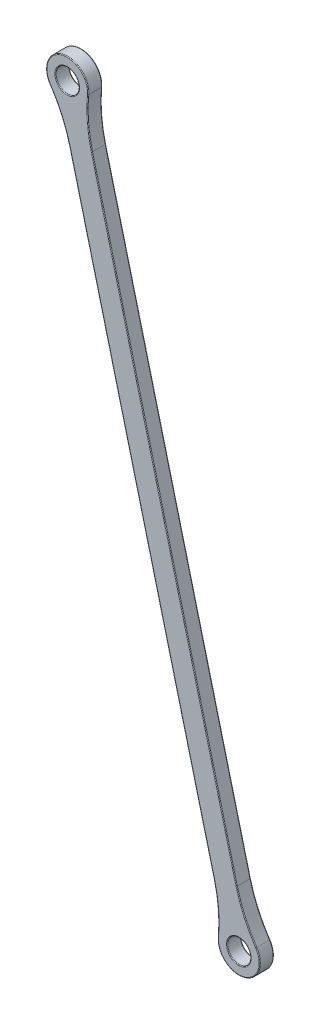
ISO-10303-21;
HEADER;
FILE_DESCRIPTION(('STEP AP214'),'2;1');
FILE_NAME('part.step','',(''),(''),'','','');
FILE_SCHEMA(('AUTOMOTIVE_DESIGN { 1 0 10303 214 1 1 1 1 }'));
ENDSEC;
DATA;
#1=APPLICATION_CONTEXT('core data for automotive mechanical design processes');
#2=APPLICATION_PROTOCOL_DEFINITION('international standard','automotive_design',2000,#1);
#3=PRODUCT_CONTEXT('',#1,'mechanical');
#4=PRODUCT('Part','Part','',(#3));
#5=PRODUCT_RELATED_PRODUCT_CATEGORY('part','',(#4));
#6=PRODUCT_DEFINITION_FORMATION('','',#4);
#7=PRODUCT_DEFINITION_CONTEXT('part definition',#1,'design');
#8=PRODUCT_DEFINITION('design','',#6,#7);
#9=PRODUCT_DEFINITION_SHAPE('','',#8);
#10=(LENGTH_UNIT() NAMED_UNIT(*) SI_UNIT(.MILLI.,.METRE.));
#11=(NAMED_UNIT(*) PLANE_ANGLE_UNIT() SI_UNIT($,.RADIAN.));
#12=(NAMED_UNIT(*) SI_UNIT($,.STERADIAN.) SOLID_ANGLE_UNIT());
#13=UNCERTAINTY_MEASURE_WITH_UNIT(LENGTH_MEASURE(1.E-05),#10,'distance_accuracy_value','');
#14=(GEOMETRIC_REPRESENTATION_CONTEXT(3) GLOBAL_UNCERTAINTY_ASSIGNED_CONTEXT((#13)) GLOBAL_UNIT_ASSIGNED_CONTEXT((#10,
#11,#12)) REPRESENTATION_CONTEXT('',''));
#15=CARTESIAN_POINT('',(0.,0.,0.));
#16=DIRECTION('',(0.,0.,1.));
#17=DIRECTION('',(1.,0.,0.));
#18=AXIS2_PLACEMENT_3D('',#15,#16,#17);
#19=CARTESIAN_POINT('',(35.6625870246691,9.16043493420126,3.));
#20=DIRECTION('',(0.968558042337355,0.248787697894472,0.));
#21=DIRECTION('',(-0.248787697894472,0.968558042337355,0.));
#22=AXIS2_PLACEMENT_3D('',#19,#20,#21);
#23=PLANE('',#22);
#24=DIRECTION('',(0.,0.,1.));
#25=VECTOR('',#24,1.);
#26=CARTESIAN_POINT('',(14.0414692915963,93.3338391737195,0.));
#27=LINE('',#26,#25);
#28=CARTESIAN_POINT('',(14.0414692915963,93.3338391737195,2.85));
#29=VERTEX_POINT('',#28);
#30=CARTESIAN_POINT('',(14.0414692915963,93.3338391737195,0.15));
#31=VERTEX_POINT('',#30);
#32=EDGE_CURVE('E340',#29,#31,#27,.F.);
#33=ORIENTED_EDGE('',*,*,#32,.T.);
#34=DIRECTION('',(0.248787697894472,-0.968558042337355,0.));
#35=VECTOR('',#34,1.);
#36=CARTESIAN_POINT('',(-17.0192583682913,214.256689581681,0.15));
#37=LINE('',#36,#35);
#38=CARTESIAN_POINT('',(-17.0192583682913,214.256689581681,0.15));
#39=VERTEX_POINT('',#38);
#40=EDGE_CURVE('E220',#31,#39,#37,.F.);
#41=ORIENTED_EDGE('',*,*,#40,.T.);
#42=DIRECTION('',(0.,0.,-1.));
#43=VECTOR('',#42,1.);
#44=CARTESIAN_POINT('',(-17.0192583682913,214.256689581681,3.));
#45=LINE('',#44,#43);
#46=CARTESIAN_POINT('',(-17.0192583682913,214.256689581681,2.85));
#47=VERTEX_POINT('',#46);
#48=EDGE_CURVE('E263',#39,#47,#45,.F.);
#49=ORIENTED_EDGE('',*,*,#48,.T.);
#50=DIRECTION('',(0.248787697894472,-0.968558042337355,0.));
#51=VECTOR('',#50,1.);
#52=CARTESIAN_POINT('',(35.6625870246691,9.16043493420126,2.85));
#53=LINE('',#52,#51);
#54=EDGE_CURVE('E218',#47,#29,#53,.T.);
#55=ORIENTED_EDGE('',*,*,#54,.T.);
#56=EDGE_LOOP('',(#33,#41,#49,#55));
#57=FACE_BOUND('',#56,.T.);
#58=ADVANCED_FACE('F34',(#57),#23,.T.);
#59=CARTESIAN_POINT('',(-22.3205792883818,224.846590265929,3.));
#60=DIRECTION('',(0.,0.,-1.));
#61=DIRECTION('',(-1.,0.,0.));
#62=AXIS2_PLACEMENT_3D('',#59,#60,#61);
#63=CYLINDRICAL_SURFACE('',#62,4.50000000000009);
#64=DIRECTION('',(0.,0.,-1.));
#65=VECTOR('',#64,1.);
#66=CARTESIAN_POINT('',(-17.8390929157455,224.438815951049,3.));
#67=LINE('',#66,#65);
#68=CARTESIAN_POINT('',(-17.8390929157455,224.438815951049,2.85));
#69=VERTEX_POINT('',#68);
#70=CARTESIAN_POINT('',(-17.8390929157455,224.438815951049,0.15));
#71=VERTEX_POINT('',#70);
#72=EDGE_CURVE('E306',#69,#71,#67,.T.);
#73=ORIENTED_EDGE('',*,*,#72,.T.);
#74=CARTESIAN_POINT('',(-22.3205792883818,224.846590265929,0.15));
#75=DIRECTION('',(0.,0.,1.));
#76=DIRECTION('',(1.,0.,0.));
#77=AXIS2_PLACEMENT_3D('',#74,#75,#76);
#78=CIRCLE('',#77,4.50000000000009);
#79=CARTESIAN_POINT('',(-26.0507806659971,222.329528947161,0.15));
#80=VERTEX_POINT('',#79);
#81=EDGE_CURVE('E228',#71,#80,#78,.T.);
#82=ORIENTED_EDGE('',*,*,#81,.T.);
#83=DIRECTION('',(0.,0.,-1.));
#84=VECTOR('',#83,1.);
#85=CARTESIAN_POINT('',(-26.0507806659971,222.329528947161,3.));
#86=LINE('',#85,#84);
#87=CARTESIAN_POINT('',(-26.0507806659971,222.329528947161,2.85));
#88=VERTEX_POINT('',#87);
#89=EDGE_CURVE('E169',#80,#88,#86,.F.);
#90=ORIENTED_EDGE('',*,*,#89,.T.);
#91=CARTESIAN_POINT('',(-22.3205792883818,224.846590265929,2.85));
#92=DIRECTION('',(0.,0.,1.));
#93=DIRECTION('',(1.,0.,0.));
#94=AXIS2_PLACEMENT_3D('',#91,#92,#93);
#95=CIRCLE('',#94,4.50000000000009);
#96=EDGE_CURVE('E226',#88,#69,#95,.F.);
#97=ORIENTED_EDGE('',*,*,#96,.T.);
#98=EDGE_LOOP('',(#73,#82,#90,#97));
#99=FACE_BOUND('',#98,.T.);
#100=ADVANCED_FACE('F304',(#99),#63,.T.);
#101=CARTESIAN_POINT('',(30.8197968129824,7.91649644472891,3.));
#102=DIRECTION('',(0.968558042337355,0.248787697894472,0.));
#103=DIRECTION('',(-0.248787697894472,0.968558042337355,0.));
#104=AXIS2_PLACEMENT_3D('',#101,#102,#103);
#105=PLANE('',#104);
#106=DIRECTION('',(0.,0.,1.));
#107=VECTOR('',#106,1.);
#108=CARTESIAN_POINT('',(-21.8620485799781,213.012751092209,0.));
#109=LINE('',#108,#107);
#110=CARTESIAN_POINT('',(-21.8620485799781,213.012751092209,2.85));
#111=VERTEX_POINT('',#110);
#112=CARTESIAN_POINT('',(-21.8620485799781,213.012751092209,0.15));
#113=VERTEX_POINT('',#112);
#114=EDGE_CURVE('E301',#111,#113,#109,.F.);
#115=ORIENTED_EDGE('',*,*,#114,.T.);
#116=DIRECTION('',(0.248787697894472,-0.968558042337355,0.));
#117=VECTOR('',#116,1.);
#118=CARTESIAN_POINT('',(30.8197968129824,7.91649644472891,0.15));
#119=LINE('',#118,#117);
#120=CARTESIAN_POINT('',(9.19867907990951,92.0899006842471,0.15));
#121=VERTEX_POINT('',#120);
#122=EDGE_CURVE('E203',#113,#121,#119,.T.);
#123=ORIENTED_EDGE('',*,*,#122,.T.);
#124=DIRECTION('',(0.,0.,-1.));
#125=VECTOR('',#124,1.);
#126=CARTESIAN_POINT('',(9.19867907990951,92.0899006842471,3.));
#127=LINE('',#126,#125);
#128=CARTESIAN_POINT('',(9.19867907990951,92.0899006842471,2.85));
#129=VERTEX_POINT('',#128);
#130=EDGE_CURVE('E308',#121,#129,#127,.F.);
#131=ORIENTED_EDGE('',*,*,#130,.T.);
#132=DIRECTION('',(0.248787697894472,-0.968558042337355,0.));
#133=VECTOR('',#132,1.);
#134=CARTESIAN_POINT('',(-21.8620485799781,213.012751092209,2.85));
#135=LINE('',#134,#133);
#136=EDGE_CURVE('E201',#129,#111,#135,.F.);
#137=ORIENTED_EDGE('',*,*,#136,.T.);
#138=EDGE_LOOP('',(#115,#123,#131,#137));
#139=FACE_BOUND('',#138,.T.);
#140=ADVANCED_FACE('F331',(#139),#105,.F.);
#141=CARTESIAN_POINT('',(14.5,81.5000000000001,3.));
#142=DIRECTION('',(0.,0.,-1.));
#143=DIRECTION('',(-1.,0.,0.));
#144=AXIS2_PLACEMENT_3D('',#141,#142,#143);
#145=CYLINDRICAL_SURFACE('',#144,2.49999999999998);
#146=CARTESIAN_POINT('',(14.5,81.5000000000001,0.15));
#147=DIRECTION('',(0.,0.,1.));
#148=DIRECTION('',(1.,0.,0.));
#149=AXIS2_PLACEMENT_3D('',#146,#147,#148);
#150=CIRCLE('',#149,2.49999999999998);
#151=CARTESIAN_POINT('',(17.,81.5000000000001,0.15));
#152=VERTEX_POINT('',#151);
#153=EDGE_CURVE('E195',#152,#152,#150,.F.);
#154=ORIENTED_EDGE('',*,*,#153,.T.);
#155=EDGE_LOOP('',(#154));
#156=FACE_BOUND('',#155,.T.);
#157=CARTESIAN_POINT('',(14.5,81.5000000000001,2.85));
#158=DIRECTION('',(0.,0.,1.));
#159=DIRECTION('',(1.,0.,0.));
#160=AXIS2_PLACEMENT_3D('',#157,#158,#159);
#161=CIRCLE('',#160,2.49999999999998);
#162=CARTESIAN_POINT('',(17.,81.5000000000001,2.85));
#163=VERTEX_POINT('',#162);
#164=EDGE_CURVE('E192',#163,#163,#161,.T.);
#165=ORIENTED_EDGE('',*,*,#164,.T.);
#166=EDGE_LOOP('',(#165));
#167=FACE_BOUND('',#166,.T.);
#168=ADVANCED_FACE('F638',(#156,#167),#145,.F.);
#169=CARTESIAN_POINT('',(14.5,81.5,3.));
#170=DIRECTION('',(0.,0.,-1.));
#171=DIRECTION('',(-1.,0.,0.));
#172=AXIS2_PLACEMENT_3D('',#169,#170,#171);
#173=CYLINDRICAL_SURFACE('',#172,4.50000000000006);
#174=DIRECTION('',(0.,0.,-1.));
#175=VECTOR('',#174,1.);
#176=CARTESIAN_POINT('',(10.0185136273637,81.90777431488,3.));
#177=LINE('',#176,#175);
#178=CARTESIAN_POINT('',(10.0185136273637,81.90777431488,2.85));
#179=VERTEX_POINT('',#178);
#180=CARTESIAN_POINT('',(10.0185136273637,81.90777431488,0.15));
#181=VERTEX_POINT('',#180);
#182=EDGE_CURVE('E335',#179,#181,#177,.T.);
#183=ORIENTED_EDGE('',*,*,#182,.T.);
#184=CARTESIAN_POINT('',(14.5,81.5,0.15));
#185=DIRECTION('',(0.,0.,1.));
#186=DIRECTION('',(1.,0.,0.));
#187=AXIS2_PLACEMENT_3D('',#184,#185,#186);
#188=CIRCLE('',#187,4.50000000000006);
#189=CARTESIAN_POINT('',(18.2302013776153,84.0170613187679,0.15));
#190=VERTEX_POINT('',#189);
#191=EDGE_CURVE('E211',#181,#190,#188,.T.);
#192=ORIENTED_EDGE('',*,*,#191,.T.);
#193=DIRECTION('',(0.,0.,-1.));
#194=VECTOR('',#193,1.);
#195=CARTESIAN_POINT('',(18.2302013776153,84.0170613187679,3.));
#196=LINE('',#195,#194);
#197=CARTESIAN_POINT('',(18.2302013776153,84.0170613187679,2.85));
#198=VERTEX_POINT('',#197);
#199=EDGE_CURVE('E332',#190,#198,#196,.F.);
#200=ORIENTED_EDGE('',*,*,#199,.T.);
#201=CARTESIAN_POINT('',(14.5,81.5,2.85));
#202=DIRECTION('',(0.,0.,1.));
#203=DIRECTION('',(1.,0.,0.));
#204=AXIS2_PLACEMENT_3D('',#201,#202,#203);
#205=CIRCLE('',#204,4.50000000000006);
#206=EDGE_CURVE('E209',#198,#179,#205,.F.);
#207=ORIENTED_EDGE('',*,*,#206,.T.);
#208=EDGE_LOOP('',(#183,#192,#200,#207));
#209=FACE_BOUND('',#208,.T.);
#210=ADVANCED_FACE('F370',(#209),#173,.T.);
#211=CARTESIAN_POINT('',(-22.3205792883818,224.846590265929,3.));
#212=DIRECTION('',(0.,0.,-1.));
#213=DIRECTION('',(-1.,0.,0.));
#214=AXIS2_PLACEMENT_3D('',#211,#212,#213);
#215=CYLINDRICAL_SURFACE('',#214,2.49999999999998);
#216=CARTESIAN_POINT('',(-22.3205792883818,224.846590265929,0.15));
#217=DIRECTION('',(0.,0.,1.));
#218=DIRECTION('',(1.,0.,0.));
#219=AXIS2_PLACEMENT_3D('',#216,#217,#218);
#220=CIRCLE('',#219,2.49999999999998);
#221=CARTESIAN_POINT('',(-19.8205792883818,224.846590265929,0.15));
#222=VERTEX_POINT('',#221);
#223=EDGE_CURVE('E189',#222,#222,#220,.F.);
#224=ORIENTED_EDGE('',*,*,#223,.T.);
#225=EDGE_LOOP('',(#224));
#226=FACE_BOUND('',#225,.T.);
#227=CARTESIAN_POINT('',(-22.3205792883818,224.846590265929,2.85));
#228=DIRECTION('',(0.,0.,1.));
#229=DIRECTION('',(1.,0.,0.));
#230=AXIS2_PLACEMENT_3D('',#227,#228,#229);
#231=CIRCLE('',#230,2.49999999999998);
#232=CARTESIAN_POINT('',(-19.8205792883818,224.846590265929,2.85));
#233=VERTEX_POINT('',#232);
#234=EDGE_CURVE('E186',#233,#233,#231,.T.);
#235=ORIENTED_EDGE('',*,*,#234,.T.);
#236=EDGE_LOOP('',(#235));
#237=FACE_BOUND('',#236,.T.);
#238=ADVANCED_FACE('F615',(#226,#237),#215,.F.);
#239=CARTESIAN_POINT('',(0.,0.,3.));
#240=DIRECTION('',(0.,0.,1.));
#241=DIRECTION('',(1.,0.,0.));
#242=AXIS2_PLACEMENT_3D('',#239,#240,#241);
#243=PLANE('',#242);
#244=CARTESIAN_POINT('',(-22.3205792883818,224.846590265929,3.));
#245=DIRECTION('',(0.,0.,1.));
#246=DIRECTION('',(1.,0.,0.));
#247=AXIS2_PLACEMENT_3D('',#244,#245,#246);
#248=CIRCLE('',#247,2.64999999999998);
#249=CARTESIAN_POINT('',(-19.6705792883818,224.846590265929,3.));
#250=VERTEX_POINT('',#249);
#251=EDGE_CURVE('E11',#250,#250,#248,.F.);
#252=ORIENTED_EDGE('',*,*,#251,.T.);
#253=EDGE_LOOP('',(#252));
#254=FACE_BOUND('',#253,.T.);
#255=CARTESIAN_POINT('',(14.5,81.5000000000001,3.));
#256=DIRECTION('',(0.,0.,1.));
#257=DIRECTION('',(1.,0.,0.));
#258=AXIS2_PLACEMENT_3D('',#255,#256,#257);
#259=CIRCLE('',#258,2.64999999999998);
#260=CARTESIAN_POINT('',(17.15,81.5000000000001,3.));
#261=VERTEX_POINT('',#260);
#262=EDGE_CURVE('E43',#261,#261,#259,.F.);
#263=ORIENTED_EDGE('',*,*,#262,.T.);
#264=EDGE_LOOP('',(#263));
#265=FACE_BOUND('',#264,.T.);
#266=CARTESIAN_POINT('',(14.5,81.5,3.));
#267=DIRECTION('',(0.,0.,1.));
#268=DIRECTION('',(1.,0.,0.));
#269=AXIS2_PLACEMENT_3D('',#266,#267,#268);
#270=CIRCLE('',#269,4.35000000000006);
#271=CARTESIAN_POINT('',(10.1678965064516,81.8941818377173,3.));
#272=VERTEX_POINT('',#271);
#273=CARTESIAN_POINT('',(18.1058613316948,83.933159274809,3.));
#274=VERTEX_POINT('',#273);
#275=EDGE_CURVE('E51',#272,#274,#270,.T.);
#276=ORIENTED_EDGE('',*,*,#275,.T.);
#277=CARTESIAN_POINT('',(43.0982105617169,100.797470110554,3.));
#278=DIRECTION('',(0.,0.,1.));
#279=DIRECTION('',(1.,0.,0.));
#280=AXIS2_PLACEMENT_3D('',#277,#278,#279);
#281=CIRCLE('',#280,30.15);
#282=CARTESIAN_POINT('',(13.8961855852456,93.2965210190353,3.));
#283=VERTEX_POINT('',#282);
#284=EDGE_CURVE('E242',#274,#283,#281,.F.);
#285=ORIENTED_EDGE('',*,*,#284,.T.);
#286=DIRECTION('',(0.248787697894472,-0.968558042337355,0.));
#287=VECTOR('',#286,1.);
#288=CARTESIAN_POINT('',(35.5173033183185,9.12311677951709,3.));
#289=LINE('',#288,#287);
#290=CARTESIAN_POINT('',(-17.1645420746419,214.219371426997,3.));
#291=VERTEX_POINT('',#290);
#292=EDGE_CURVE('E230',#283,#291,#289,.F.);
#293=ORIENTED_EDGE('',*,*,#292,.T.);
#294=CARTESIAN_POINT('',(12.0374829018293,221.720320518516,3.));
#295=DIRECTION('',(0.,0.,1.));
#296=DIRECTION('',(1.,0.,0.));
#297=AXIS2_PLACEMENT_3D('',#294,#295,#296);
#298=CIRCLE('',#297,30.15);
#299=CARTESIAN_POINT('',(-17.9884757948334,224.452408428211,3.));
#300=VERTEX_POINT('',#299);
#301=EDGE_CURVE('E232',#291,#300,#298,.F.);
#302=ORIENTED_EDGE('',*,*,#301,.T.);
#303=CARTESIAN_POINT('',(-22.3205792883818,224.846590265929,3.));
#304=DIRECTION('',(0.,0.,1.));
#305=DIRECTION('',(1.,0.,0.));
#306=AXIS2_PLACEMENT_3D('',#303,#304,#305);
#307=CIRCLE('',#306,4.35000000000009);
#308=CARTESIAN_POINT('',(-25.9264406200766,222.41343099112,3.));
#309=VERTEX_POINT('',#308);
#310=EDGE_CURVE('E234',#300,#309,#307,.T.);
#311=ORIENTED_EDGE('',*,*,#310,.T.);
#312=CARTESIAN_POINT('',(-50.9187898500987,205.549120155375,3.));
#313=DIRECTION('',(0.,0.,1.));
#314=DIRECTION('',(1.,0.,0.));
#315=AXIS2_PLACEMENT_3D('',#312,#313,#314);
#316=CIRCLE('',#315,30.15);
#317=CARTESIAN_POINT('',(-21.7167648736275,213.050069246893,3.));
#318=VERTEX_POINT('',#317);
#319=EDGE_CURVE('E236',#309,#318,#316,.F.);
#320=ORIENTED_EDGE('',*,*,#319,.T.);
#321=DIRECTION('',(0.248787697894472,-0.968558042337355,0.));
#322=VECTOR('',#321,1.);
#323=CARTESIAN_POINT('',(9.3439627862601,92.1272188389313,3.));
#324=LINE('',#323,#322);
#325=CARTESIAN_POINT('',(9.34396278626011,92.1272188389312,3.));
#326=VERTEX_POINT('',#325);
#327=EDGE_CURVE('E238',#318,#326,#324,.T.);
#328=ORIENTED_EDGE('',*,*,#327,.T.);
#329=CARTESIAN_POINT('',(-19.8580621902111,84.6262697474129,3.));
#330=DIRECTION('',(0.,0.,1.));
#331=DIRECTION('',(1.,0.,0.));
#332=AXIS2_PLACEMENT_3D('',#329,#330,#331);
#333=CIRCLE('',#332,30.15);
#334=EDGE_CURVE('E56',#326,#272,#333,.F.);
#335=ORIENTED_EDGE('',*,*,#334,.T.);
#336=EDGE_LOOP('',(#276,#285,#293,#302,#311,#320,#328,#335));
#337=FACE_BOUND('',#336,.T.);
#338=ADVANCED_FACE('F389',(#254,#265,#337),#243,.T.);
#339=CARTESIAN_POINT('',(0.,0.,0.));
#340=DIRECTION('',(0.,0.,1.));
#341=DIRECTION('',(1.,0.,0.));
#342=AXIS2_PLACEMENT_3D('',#339,#340,#341);
#343=PLANE('',#342);
#344=CARTESIAN_POINT('',(-22.3205792883818,224.846590265929,0.));
#345=DIRECTION('',(0.,0.,1.));
#346=DIRECTION('',(1.,0.,0.));
#347=AXIS2_PLACEMENT_3D('',#344,#345,#346);
#348=CIRCLE('',#347,2.64999999999998);
#349=CARTESIAN_POINT('',(-19.6705792883818,224.846590265929,0.));
#350=VERTEX_POINT('',#349);
#351=EDGE_CURVE('E178',#350,#350,#348,.T.);
#352=ORIENTED_EDGE('',*,*,#351,.T.);
#353=EDGE_LOOP('',(#352));
#354=FACE_BOUND('',#353,.T.);
#355=CARTESIAN_POINT('',(14.5,81.5000000000001,0.));
#356=DIRECTION('',(0.,0.,1.));
#357=DIRECTION('',(1.,0.,0.));
#358=AXIS2_PLACEMENT_3D('',#355,#356,#357);
#359=CIRCLE('',#358,2.64999999999998);
#360=CARTESIAN_POINT('',(17.15,81.5000000000001,0.));
#361=VERTEX_POINT('',#360);
#362=EDGE_CURVE('E175',#361,#361,#359,.T.);
#363=ORIENTED_EDGE('',*,*,#362,.T.);
#364=EDGE_LOOP('',(#363));
#365=FACE_BOUND('',#364,.T.);
#366=DIRECTION('',(0.248787697894472,-0.968558042337355,0.));
#367=VECTOR('',#366,1.);
#368=CARTESIAN_POINT('',(30.965080519333,7.95381459941308,0.));
#369=LINE('',#368,#367);
#370=CARTESIAN_POINT('',(9.34396278626012,92.1272188389312,0.));
#371=VERTEX_POINT('',#370);
#372=CARTESIAN_POINT('',(-21.7167648736275,213.050069246893,0.));
#373=VERTEX_POINT('',#372);
#374=EDGE_CURVE('E173',#371,#373,#369,.F.);
#375=ORIENTED_EDGE('',*,*,#374,.T.);
#376=CARTESIAN_POINT('',(-50.9187898500987,205.549120155375,0.));
#377=DIRECTION('',(0.,0.,1.));
#378=DIRECTION('',(1.,0.,0.));
#379=AXIS2_PLACEMENT_3D('',#376,#377,#378);
#380=CIRCLE('',#379,30.15);
#381=CARTESIAN_POINT('',(-25.9264406200766,222.41343099112,0.));
#382=VERTEX_POINT('',#381);
#383=EDGE_CURVE('E154',#373,#382,#380,.T.);
#384=ORIENTED_EDGE('',*,*,#383,.T.);
#385=CARTESIAN_POINT('',(-22.3205792883818,224.846590265929,0.));
#386=DIRECTION('',(0.,0.,1.));
#387=DIRECTION('',(1.,0.,0.));
#388=AXIS2_PLACEMENT_3D('',#385,#386,#387);
#389=CIRCLE('',#388,4.35000000000009);
#390=CARTESIAN_POINT('',(-17.9884757948334,224.452408428211,0.));
#391=VERTEX_POINT('',#390);
#392=EDGE_CURVE('E162',#382,#391,#389,.F.);
#393=ORIENTED_EDGE('',*,*,#392,.T.);
#394=CARTESIAN_POINT('',(12.0374829018293,221.720320518516,0.));
#395=DIRECTION('',(0.,0.,1.));
#396=DIRECTION('',(1.,0.,0.));
#397=AXIS2_PLACEMENT_3D('',#394,#395,#396);
#398=CIRCLE('',#397,30.15);
#399=CARTESIAN_POINT('',(-17.1645420746419,214.219371426997,0.));
#400=VERTEX_POINT('',#399);
#401=EDGE_CURVE('E168',#391,#400,#398,.T.);
#402=ORIENTED_EDGE('',*,*,#401,.T.);
#403=DIRECTION('',(0.248787697894472,-0.968558042337355,0.));
#404=VECTOR('',#403,1.);
#405=CARTESIAN_POINT('',(13.8961855852456,93.2965210190353,0.));
#406=LINE('',#405,#404);
#407=CARTESIAN_POINT('',(13.8961855852456,93.2965210190353,0.));
#408=VERTEX_POINT('',#407);
#409=EDGE_CURVE('E313',#400,#408,#406,.T.);
#410=ORIENTED_EDGE('',*,*,#409,.T.);
#411=CARTESIAN_POINT('',(43.0982105617169,100.797470110554,0.));
#412=DIRECTION('',(0.,0.,1.));
#413=DIRECTION('',(1.,0.,0.));
#414=AXIS2_PLACEMENT_3D('',#411,#412,#413);
#415=CIRCLE('',#414,30.15);
#416=CARTESIAN_POINT('',(18.1058613316948,83.933159274809,0.));
#417=VERTEX_POINT('',#416);
#418=EDGE_CURVE('E315',#408,#417,#415,.T.);
#419=ORIENTED_EDGE('',*,*,#418,.T.);
#420=CARTESIAN_POINT('',(14.5,81.5,0.));
#421=DIRECTION('',(0.,0.,1.));
#422=DIRECTION('',(1.,0.,0.));
#423=AXIS2_PLACEMENT_3D('',#420,#421,#422);
#424=CIRCLE('',#423,4.35000000000006);
#425=CARTESIAN_POINT('',(10.1678965064516,81.8941818377173,0.));
#426=VERTEX_POINT('',#425);
#427=EDGE_CURVE('E317',#417,#426,#424,.F.);
#428=ORIENTED_EDGE('',*,*,#427,.T.);
#429=CARTESIAN_POINT('',(-19.8580621902111,84.6262697474129,0.));
#430=DIRECTION('',(0.,0.,1.));
#431=DIRECTION('',(1.,0.,0.));
#432=AXIS2_PLACEMENT_3D('',#429,#430,#431);
#433=CIRCLE('',#432,30.15);
#434=EDGE_CURVE('E180',#426,#371,#433,.T.);
#435=ORIENTED_EDGE('',*,*,#434,.T.);
#436=EDGE_LOOP('',(#375,#384,#393,#402,#410,#419,#428,#435));
#437=FACE_BOUND('',#436,.T.);
#438=ADVANCED_FACE('F171',(#354,#365,#437),#343,.F.);
#439=CARTESIAN_POINT('',(43.0982105617169,100.797470110554,3.));
#440=DIRECTION('',(0.,0.,-1.));
#441=DIRECTION('',(-1.,0.,0.));
#442=AXIS2_PLACEMENT_3D('',#439,#440,#441);
#443=CYLINDRICAL_SURFACE('',#442,30.);
#444=ORIENTED_EDGE('',*,*,#199,.F.);
#445=CARTESIAN_POINT('',(43.0982105617169,100.797470110554,0.15));
#446=DIRECTION('',(0.,0.,1.));
#447=DIRECTION('',(1.,0.,0.));
#448=AXIS2_PLACEMENT_3D('',#445,#446,#447);
#449=CIRCLE('',#448,30.);
#450=EDGE_CURVE('E216',#190,#31,#449,.F.);
#451=ORIENTED_EDGE('',*,*,#450,.T.);
#452=ORIENTED_EDGE('',*,*,#32,.F.);
#453=CARTESIAN_POINT('',(43.0982105617169,100.797470110554,2.85));
#454=DIRECTION('',(0.,0.,1.));
#455=DIRECTION('',(1.,0.,0.));
#456=AXIS2_PLACEMENT_3D('',#453,#454,#455);
#457=CIRCLE('',#456,30.);
#458=EDGE_CURVE('E213',#29,#198,#457,.T.);
#459=ORIENTED_EDGE('',*,*,#458,.T.);
#460=EDGE_LOOP('',(#444,#451,#452,#459));
#461=FACE_BOUND('',#460,.T.);
#462=ADVANCED_FACE('F367',(#461),#443,.F.);
#463=CARTESIAN_POINT('',(-19.8580621902111,84.6262697474129,3.));
#464=DIRECTION('',(0.,0.,-1.));
#465=DIRECTION('',(-1.,0.,0.));
#466=AXIS2_PLACEMENT_3D('',#463,#464,#465);
#467=CYLINDRICAL_SURFACE('',#466,30.);
#468=ORIENTED_EDGE('',*,*,#130,.F.);
#469=CARTESIAN_POINT('',(-19.8580621902111,84.6262697474129,0.15));
#470=DIRECTION('',(0.,0.,1.));
#471=DIRECTION('',(1.,0.,0.));
#472=AXIS2_PLACEMENT_3D('',#469,#470,#471);
#473=CIRCLE('',#472,30.);
#474=EDGE_CURVE('E207',#121,#181,#473,.F.);
#475=ORIENTED_EDGE('',*,*,#474,.T.);
#476=ORIENTED_EDGE('',*,*,#182,.F.);
#477=CARTESIAN_POINT('',(-19.8580621902111,84.6262697474129,2.85));
#478=DIRECTION('',(0.,0.,1.));
#479=DIRECTION('',(1.,0.,0.));
#480=AXIS2_PLACEMENT_3D('',#477,#478,#479);
#481=CIRCLE('',#480,30.);
#482=EDGE_CURVE('E205',#179,#129,#481,.T.);
#483=ORIENTED_EDGE('',*,*,#482,.T.);
#484=EDGE_LOOP('',(#468,#475,#476,#483));
#485=FACE_BOUND('',#484,.T.);
#486=ADVANCED_FACE('F413',(#485),#467,.F.);
#487=CARTESIAN_POINT('',(-50.9187898500987,205.549120155375,3.));
#488=DIRECTION('',(0.,0.,-1.));
#489=DIRECTION('',(-1.,0.,0.));
#490=AXIS2_PLACEMENT_3D('',#487,#488,#489);
#491=CYLINDRICAL_SURFACE('',#490,30.);
#492=ORIENTED_EDGE('',*,*,#89,.F.);
#493=CARTESIAN_POINT('',(-50.9187898500987,205.549120155375,0.15));
#494=DIRECTION('',(0.,0.,1.));
#495=DIRECTION('',(1.,0.,0.));
#496=AXIS2_PLACEMENT_3D('',#493,#494,#495);
#497=CIRCLE('',#496,30.);
#498=EDGE_CURVE('E156',#80,#113,#497,.F.);
#499=ORIENTED_EDGE('',*,*,#498,.T.);
#500=ORIENTED_EDGE('',*,*,#114,.F.);
#501=CARTESIAN_POINT('',(-50.9187898500987,205.549120155375,2.85));
#502=DIRECTION('',(0.,0.,1.));
#503=DIRECTION('',(1.,0.,0.));
#504=AXIS2_PLACEMENT_3D('',#501,#502,#503);
#505=CIRCLE('',#504,30.);
#506=EDGE_CURVE('E198',#111,#88,#505,.T.);
#507=ORIENTED_EDGE('',*,*,#506,.T.);
#508=EDGE_LOOP('',(#492,#499,#500,#507));
#509=FACE_BOUND('',#508,.T.);
#510=ADVANCED_FACE('F299',(#509),#491,.F.);
#511=CARTESIAN_POINT('',(12.0374829018293,221.720320518516,3.));
#512=DIRECTION('',(0.,0.,-1.));
#513=DIRECTION('',(-1.,0.,0.));
#514=AXIS2_PLACEMENT_3D('',#511,#512,#513);
#515=CYLINDRICAL_SURFACE('',#514,30.);
#516=ORIENTED_EDGE('',*,*,#48,.F.);
#517=CARTESIAN_POINT('',(12.0374829018293,221.720320518516,0.15));
#518=DIRECTION('',(0.,0.,1.));
#519=DIRECTION('',(1.,0.,0.));
#520=AXIS2_PLACEMENT_3D('',#517,#518,#519);
#521=CIRCLE('',#520,30.);
#522=EDGE_CURVE('E224',#39,#71,#521,.F.);
#523=ORIENTED_EDGE('',*,*,#522,.T.);
#524=ORIENTED_EDGE('',*,*,#72,.F.);
#525=CARTESIAN_POINT('',(12.0374829018293,221.720320518516,2.85));
#526=DIRECTION('',(0.,0.,1.));
#527=DIRECTION('',(1.,0.,0.));
#528=AXIS2_PLACEMENT_3D('',#525,#526,#527);
#529=CIRCLE('',#528,30.);
#530=EDGE_CURVE('E222',#69,#47,#529,.T.);
#531=ORIENTED_EDGE('',*,*,#530,.T.);
#532=EDGE_LOOP('',(#516,#523,#524,#531));
#533=FACE_BOUND('',#532,.T.);
#534=ADVANCED_FACE('F386',(#533),#515,.F.);
#535=CARTESIAN_POINT('',(-22.3205792883818,224.846590265929,0.15));
#536=DIRECTION('',(0.,0.,1.));
#537=DIRECTION('',(1.,0.,0.));
#538=AXIS2_PLACEMENT_3D('',#535,#536,#537);
#539=TOROIDAL_SURFACE('',#538,2.64999999999998,0.15);
#540=ORIENTED_EDGE('',*,*,#223,.F.);
#541=EDGE_LOOP('',(#540));
#542=FACE_BOUND('',#541,.T.);
#543=ORIENTED_EDGE('',*,*,#351,.F.);
#544=EDGE_LOOP('',(#543));
#545=FACE_BOUND('',#544,.T.);
#546=ADVANCED_FACE('F421',(#542,#545),#539,.T.);
#547=CARTESIAN_POINT('',(14.5,81.5000000000001,0.15));
#548=DIRECTION('',(0.,0.,1.));
#549=DIRECTION('',(1.,0.,0.));
#550=AXIS2_PLACEMENT_3D('',#547,#548,#549);
#551=TOROIDAL_SURFACE('',#550,2.64999999999998,0.15);
#552=ORIENTED_EDGE('',*,*,#153,.F.);
#553=EDGE_LOOP('',(#552));
#554=FACE_BOUND('',#553,.T.);
#555=ORIENTED_EDGE('',*,*,#362,.F.);
#556=EDGE_LOOP('',(#555));
#557=FACE_BOUND('',#556,.T.);
#558=ADVANCED_FACE('F424',(#554,#557),#551,.T.);
#559=CARTESIAN_POINT('',(43.0982105617169,100.797470110554,0.15));
#560=DIRECTION('',(0.,0.,1.));
#561=DIRECTION('',(1.,0.,0.));
#562=AXIS2_PLACEMENT_3D('',#559,#560,#561);
#563=TOROIDAL_SURFACE('',#562,30.15,0.15);
#564=CARTESIAN_POINT('',(13.8961855852456,93.2965210190353,0.15));
#565=DIRECTION('',(-0.24878769789451,0.968558042337345,0.));
#566=DIRECTION('',(-0.968558042337345,-0.24878769789451,0.));
#567=AXIS2_PLACEMENT_3D('',#564,#565,#566);
#568=CIRCLE('',#567,0.15);
#569=EDGE_CURVE('E257',#31,#408,#568,.T.);
#570=ORIENTED_EDGE('',*,*,#569,.F.);
#571=ORIENTED_EDGE('',*,*,#450,.F.);
#572=CARTESIAN_POINT('',(18.1058613316948,83.933159274809,0.15));
#573=DIRECTION('',(0.559346959726201,-0.828933639470046,0.));
#574=DIRECTION('',(0.828933639470046,0.559346959726201,0.));
#575=AXIS2_PLACEMENT_3D('',#572,#573,#574);
#576=CIRCLE('',#575,0.15);
#577=EDGE_CURVE('E260',#417,#190,#576,.T.);
#578=ORIENTED_EDGE('',*,*,#577,.F.);
#579=ORIENTED_EDGE('',*,*,#418,.F.);
#580=EDGE_LOOP('',(#570,#571,#578,#579));
#581=FACE_BOUND('',#580,.T.);
#582=ADVANCED_FACE('F379',(#581),#563,.T.);
#583=CARTESIAN_POINT('',(14.5,81.5,0.15));
#584=DIRECTION('',(0.,0.,1.));
#585=DIRECTION('',(1.,0.,0.));
#586=AXIS2_PLACEMENT_3D('',#583,#584,#585);
#587=TOROIDAL_SURFACE('',#586,4.35000000000006,0.15);
#588=ORIENTED_EDGE('',*,*,#577,.T.);
#589=ORIENTED_EDGE('',*,*,#191,.F.);
#590=CARTESIAN_POINT('',(10.1678965064516,81.8941818377173,0.15));
#591=DIRECTION('',(0.0906165144177559,0.995885860585829,0.));
#592=DIRECTION('',(-0.995885860585829,0.0906165144177559,0.));
#593=AXIS2_PLACEMENT_3D('',#590,#591,#592);
#594=CIRCLE('',#593,0.15);
#595=EDGE_CURVE('E254',#426,#181,#594,.T.);
#596=ORIENTED_EDGE('',*,*,#595,.F.);
#597=ORIENTED_EDGE('',*,*,#427,.F.);
#598=EDGE_LOOP('',(#588,#589,#596,#597));
#599=FACE_BOUND('',#598,.T.);
#600=ADVANCED_FACE('F374',(#599),#587,.T.);
#601=CARTESIAN_POINT('',(35.5173033183185,9.12311677951709,0.15));
#602=DIRECTION('',(-0.248787697894472,0.968558042337355,0.));
#603=DIRECTION('',(-0.968558042337355,-0.248787697894472,0.));
#604=AXIS2_PLACEMENT_3D('',#601,#602,#603);
#605=CYLINDRICAL_SURFACE('',#604,0.15);
#606=ORIENTED_EDGE('',*,*,#569,.T.);
#607=ORIENTED_EDGE('',*,*,#409,.F.);
#608=CARTESIAN_POINT('',(-17.1645420746419,214.219371426997,0.15));
#609=DIRECTION('',(-0.248787697894423,0.968558042337367,0.));
#610=DIRECTION('',(-0.968558042337367,-0.248787697894423,0.));
#611=AXIS2_PLACEMENT_3D('',#608,#609,#610);
#612=CIRCLE('',#611,0.15);
#613=EDGE_CURVE('E251',#39,#400,#612,.T.);
#614=ORIENTED_EDGE('',*,*,#613,.F.);
#615=ORIENTED_EDGE('',*,*,#40,.F.);
#616=EDGE_LOOP('',(#606,#607,#614,#615));
#617=FACE_BOUND('',#616,.T.);
#618=ADVANCED_FACE('F382',(#617),#605,.T.);
#619=CARTESIAN_POINT('',(-19.8580621902111,84.6262697474129,0.15));
#620=DIRECTION('',(0.,0.,1.));
#621=DIRECTION('',(1.,0.,0.));
#622=AXIS2_PLACEMENT_3D('',#619,#620,#621);
#623=TOROIDAL_SURFACE('',#622,30.15,0.15);
#624=ORIENTED_EDGE('',*,*,#595,.T.);
#625=ORIENTED_EDGE('',*,*,#474,.F.);
#626=CARTESIAN_POINT('',(9.34396278626012,92.1272188389312,0.15));
#627=DIRECTION('',(-0.24878769789451,0.968558042337345,0.));
#628=DIRECTION('',(-0.968558042337345,-0.24878769789451,0.));
#629=AXIS2_PLACEMENT_3D('',#626,#627,#628);
#630=CIRCLE('',#629,0.15);
#631=EDGE_CURVE('E248',#371,#121,#630,.T.);
#632=ORIENTED_EDGE('',*,*,#631,.F.);
#633=ORIENTED_EDGE('',*,*,#434,.F.);
#634=EDGE_LOOP('',(#624,#625,#632,#633));
#635=FACE_BOUND('',#634,.T.);
#636=ADVANCED_FACE('F324',(#635),#623,.T.);
#637=CARTESIAN_POINT('',(12.0374829018293,221.720320518516,0.15));
#638=DIRECTION('',(0.,0.,1.));
#639=DIRECTION('',(1.,0.,0.));
#640=AXIS2_PLACEMENT_3D('',#637,#638,#639);
#641=TOROIDAL_SURFACE('',#640,30.15,0.15);
#642=ORIENTED_EDGE('',*,*,#613,.T.);
#643=ORIENTED_EDGE('',*,*,#401,.F.);
#644=CARTESIAN_POINT('',(-17.9884757948334,224.452408428211,0.15));
#645=DIRECTION('',(0.0906165144178466,0.995885860585821,0.));
#646=DIRECTION('',(-0.995885860585821,0.0906165144178466,0.));
#647=AXIS2_PLACEMENT_3D('',#644,#645,#646);
#648=CIRCLE('',#647,0.15);
#649=EDGE_CURVE('E165',#71,#391,#648,.T.);
#650=ORIENTED_EDGE('',*,*,#649,.F.);
#651=ORIENTED_EDGE('',*,*,#522,.F.);
#652=EDGE_LOOP('',(#642,#643,#650,#651));
#653=FACE_BOUND('',#652,.T.);
#654=ADVANCED_FACE('F385',(#653),#641,.T.);
#655=CARTESIAN_POINT('',(30.965080519333,7.95381459941308,0.15));
#656=DIRECTION('',(0.248787697894472,-0.968558042337355,0.));
#657=DIRECTION('',(0.968558042337355,0.248787697894472,0.));
#658=AXIS2_PLACEMENT_3D('',#655,#656,#657);
#659=CYLINDRICAL_SURFACE('',#658,0.15);
#660=ORIENTED_EDGE('',*,*,#631,.T.);
#661=ORIENTED_EDGE('',*,*,#122,.F.);
#662=CARTESIAN_POINT('',(-21.7167648736275,213.050069246893,0.15));
#663=DIRECTION('',(-0.248787697894434,0.968558042337364,0.));
#664=DIRECTION('',(-0.968558042337364,-0.248787697894434,0.));
#665=AXIS2_PLACEMENT_3D('',#662,#663,#664);
#666=CIRCLE('',#665,0.15);
#667=EDGE_CURVE('E159',#373,#113,#666,.T.);
#668=ORIENTED_EDGE('',*,*,#667,.F.);
#669=ORIENTED_EDGE('',*,*,#374,.F.);
#670=EDGE_LOOP('',(#660,#661,#668,#669));
#671=FACE_BOUND('',#670,.T.);
#672=ADVANCED_FACE('F327',(#671),#659,.T.);
#673=CARTESIAN_POINT('',(-22.3205792883818,224.846590265929,0.15));
#674=DIRECTION('',(0.,0.,1.));
#675=DIRECTION('',(1.,0.,0.));
#676=AXIS2_PLACEMENT_3D('',#673,#674,#675);
#677=TOROIDAL_SURFACE('',#676,4.35000000000009,0.15);
#678=ORIENTED_EDGE('',*,*,#649,.T.);
#679=ORIENTED_EDGE('',*,*,#392,.F.);
#680=CARTESIAN_POINT('',(-25.9264406200766,222.41343099112,0.15));
#681=DIRECTION('',(0.559346959726137,-0.828933639470089,0.));
#682=DIRECTION('',(0.828933639470089,0.559346959726137,0.));
#683=AXIS2_PLACEMENT_3D('',#680,#681,#682);
#684=CIRCLE('',#683,0.15);
#685=EDGE_CURVE('E150',#80,#382,#684,.T.);
#686=ORIENTED_EDGE('',*,*,#685,.F.);
#687=ORIENTED_EDGE('',*,*,#81,.F.);
#688=EDGE_LOOP('',(#678,#679,#686,#687));
#689=FACE_BOUND('',#688,.T.);
#690=ADVANCED_FACE('F163',(#689),#677,.T.);
#691=CARTESIAN_POINT('',(-50.9187898500987,205.549120155375,0.15));
#692=DIRECTION('',(0.,0.,1.));
#693=DIRECTION('',(1.,0.,0.));
#694=AXIS2_PLACEMENT_3D('',#691,#692,#693);
#695=TOROIDAL_SURFACE('',#694,30.15,0.15);
#696=ORIENTED_EDGE('',*,*,#667,.T.);
#697=ORIENTED_EDGE('',*,*,#498,.F.);
#698=ORIENTED_EDGE('',*,*,#685,.T.);
#699=ORIENTED_EDGE('',*,*,#383,.F.);
#700=EDGE_LOOP('',(#696,#697,#698,#699));
#701=FACE_BOUND('',#700,.T.);
#702=ADVANCED_FACE('F152',(#701),#695,.T.);
#703=CARTESIAN_POINT('',(-22.3205792883818,224.846590265929,2.85));
#704=DIRECTION('',(0.,0.,1.));
#705=DIRECTION('',(1.,0.,0.));
#706=AXIS2_PLACEMENT_3D('',#703,#704,#705);
#707=TOROIDAL_SURFACE('',#706,2.64999999999998,0.15);
#708=ORIENTED_EDGE('',*,*,#251,.F.);
#709=EDGE_LOOP('',(#708));
#710=FACE_BOUND('',#709,.T.);
#711=ORIENTED_EDGE('',*,*,#234,.F.);
#712=EDGE_LOOP('',(#711));
#713=FACE_BOUND('',#712,.T.);
#714=ADVANCED_FACE('F431',(#710,#713),#707,.T.);
#715=CARTESIAN_POINT('',(14.5,81.5000000000001,2.85));
#716=DIRECTION('',(0.,0.,1.));
#717=DIRECTION('',(1.,0.,0.));
#718=AXIS2_PLACEMENT_3D('',#715,#716,#717);
#719=TOROIDAL_SURFACE('',#718,2.64999999999998,0.15);
#720=ORIENTED_EDGE('',*,*,#262,.F.);
#721=EDGE_LOOP('',(#720));
#722=FACE_BOUND('',#721,.T.);
#723=ORIENTED_EDGE('',*,*,#164,.F.);
#724=EDGE_LOOP('',(#723));
#725=FACE_BOUND('',#724,.T.);
#726=ADVANCED_FACE('F448',(#722,#725),#719,.T.);
#727=CARTESIAN_POINT('',(-50.9187898500987,205.549120155375,2.85));
#728=DIRECTION('',(0.,0.,1.));
#729=DIRECTION('',(1.,0.,0.));
#730=AXIS2_PLACEMENT_3D('',#727,#728,#729);
#731=TOROIDAL_SURFACE('',#730,30.15,0.15);
#732=CARTESIAN_POINT('',(-25.9264406200766,222.41343099112,2.85));
#733=DIRECTION('',(-0.559346959726137,0.828933639470089,0.));
#734=DIRECTION('',(-0.828933639470089,-0.559346959726137,0.));
#735=AXIS2_PLACEMENT_3D('',#732,#733,#734);
#736=CIRCLE('',#735,0.15);
#737=EDGE_CURVE('E279',#88,#309,#736,.T.);
#738=ORIENTED_EDGE('',*,*,#737,.F.);
#739=ORIENTED_EDGE('',*,*,#506,.F.);
#740=CARTESIAN_POINT('',(-21.7167648736275,213.050069246893,2.85));
#741=DIRECTION('',(0.248787697894417,-0.968558042337369,0.));
#742=DIRECTION('',(0.968558042337369,0.248787697894417,0.));
#743=AXIS2_PLACEMENT_3D('',#740,#741,#742);
#744=CIRCLE('',#743,0.15);
#745=EDGE_CURVE('E38',#318,#111,#744,.T.);
#746=ORIENTED_EDGE('',*,*,#745,.F.);
#747=ORIENTED_EDGE('',*,*,#319,.F.);
#748=EDGE_LOOP('',(#738,#739,#746,#747));
#749=FACE_BOUND('',#748,.T.);
#750=ADVANCED_FACE('F36',(#749),#731,.T.);
#751=CARTESIAN_POINT('',(30.965080519333,7.95381459941308,2.85));
#752=DIRECTION('',(-0.248787697894472,0.968558042337355,0.));
#753=DIRECTION('',(-0.968558042337355,-0.248787697894472,0.));
#754=AXIS2_PLACEMENT_3D('',#751,#752,#753);
#755=CYLINDRICAL_SURFACE('',#754,0.15);
#756=ORIENTED_EDGE('',*,*,#745,.T.);
#757=ORIENTED_EDGE('',*,*,#136,.F.);
#758=CARTESIAN_POINT('',(9.34396278626011,92.1272188389312,2.85));
#759=DIRECTION('',(0.248787697894518,-0.968558042337343,0.));
#760=DIRECTION('',(0.968558042337343,0.248787697894518,0.));
#761=AXIS2_PLACEMENT_3D('',#758,#759,#760);
#762=CIRCLE('',#761,0.15);
#763=EDGE_CURVE('E277',#326,#129,#762,.T.);
#764=ORIENTED_EDGE('',*,*,#763,.F.);
#765=ORIENTED_EDGE('',*,*,#327,.F.);
#766=EDGE_LOOP('',(#756,#757,#764,#765));
#767=FACE_BOUND('',#766,.T.);
#768=ADVANCED_FACE('F290',(#767),#755,.T.);
#769=CARTESIAN_POINT('',(-22.3205792883818,224.846590265929,2.85));
#770=DIRECTION('',(0.,0.,1.));
#771=DIRECTION('',(1.,0.,0.));
#772=AXIS2_PLACEMENT_3D('',#769,#770,#771);
#773=TOROIDAL_SURFACE('',#772,4.35000000000009,0.15);
#774=ORIENTED_EDGE('',*,*,#737,.T.);
#775=ORIENTED_EDGE('',*,*,#310,.F.);
#776=CARTESIAN_POINT('',(-17.9884757948334,224.452408428211,2.85));
#777=DIRECTION('',(-0.0906165144178466,-0.995885860585821,0.));
#778=DIRECTION('',(0.995885860585821,-0.0906165144178466,0.));
#779=AXIS2_PLACEMENT_3D('',#776,#777,#778);
#780=CIRCLE('',#779,0.15);
#781=EDGE_CURVE('E274',#69,#300,#780,.T.);
#782=ORIENTED_EDGE('',*,*,#781,.F.);
#783=ORIENTED_EDGE('',*,*,#96,.F.);
#784=EDGE_LOOP('',(#774,#775,#782,#783));
#785=FACE_BOUND('',#784,.T.);
#786=ADVANCED_FACE('F388',(#785),#773,.T.);
#787=CARTESIAN_POINT('',(-19.8580621902111,84.6262697474129,2.85));
#788=DIRECTION('',(0.,0.,1.));
#789=DIRECTION('',(1.,0.,0.));
#790=AXIS2_PLACEMENT_3D('',#787,#788,#789);
#791=TOROIDAL_SURFACE('',#790,30.15,0.15);
#792=ORIENTED_EDGE('',*,*,#763,.T.);
#793=ORIENTED_EDGE('',*,*,#482,.F.);
#794=CARTESIAN_POINT('',(10.1678965064516,81.8941818377173,2.85));
#795=DIRECTION('',(-0.0906165144177538,-0.995885860585829,0.));
#796=DIRECTION('',(0.995885860585829,-0.0906165144177538,0.));
#797=AXIS2_PLACEMENT_3D('',#794,#795,#796);
#798=CIRCLE('',#797,0.15);
#799=EDGE_CURVE('E271',#272,#179,#798,.T.);
#800=ORIENTED_EDGE('',*,*,#799,.F.);
#801=ORIENTED_EDGE('',*,*,#334,.F.);
#802=EDGE_LOOP('',(#792,#793,#800,#801));
#803=FACE_BOUND('',#802,.T.);
#804=ADVANCED_FACE('F392',(#803),#791,.T.);
#805=CARTESIAN_POINT('',(12.0374829018293,221.720320518516,2.85));
#806=DIRECTION('',(0.,0.,1.));
#807=DIRECTION('',(1.,0.,0.));
#808=AXIS2_PLACEMENT_3D('',#805,#806,#807);
#809=TOROIDAL_SURFACE('',#808,30.15,0.15);
#810=ORIENTED_EDGE('',*,*,#781,.T.);
#811=ORIENTED_EDGE('',*,*,#301,.F.);
#812=CARTESIAN_POINT('',(-17.1645420746419,214.219371426997,2.85));
#813=DIRECTION('',(0.248787697894423,-0.968558042337367,0.));
#814=DIRECTION('',(0.968558042337367,0.248787697894423,0.));
#815=AXIS2_PLACEMENT_3D('',#812,#813,#814);
#816=CIRCLE('',#815,0.15);
#817=EDGE_CURVE('E268',#47,#291,#816,.T.);
#818=ORIENTED_EDGE('',*,*,#817,.F.);
#819=ORIENTED_EDGE('',*,*,#530,.F.);
#820=EDGE_LOOP('',(#810,#811,#818,#819));
#821=FACE_BOUND('',#820,.T.);
#822=ADVANCED_FACE('F355',(#821),#809,.T.);
#823=CARTESIAN_POINT('',(14.5,81.5,2.85));
#824=DIRECTION('',(0.,0.,1.));
#825=DIRECTION('',(1.,0.,0.));
#826=AXIS2_PLACEMENT_3D('',#823,#824,#825);
#827=TOROIDAL_SURFACE('',#826,4.35000000000006,0.15);
#828=ORIENTED_EDGE('',*,*,#799,.T.);
#829=ORIENTED_EDGE('',*,*,#206,.F.);
#830=CARTESIAN_POINT('',(18.1058613316948,83.933159274809,2.85));
#831=DIRECTION('',(-0.559346959726201,0.828933639470046,0.));
#832=DIRECTION('',(-0.828933639470046,-0.559346959726201,0.));
#833=AXIS2_PLACEMENT_3D('',#830,#831,#832);
#834=CIRCLE('',#833,0.15);
#835=EDGE_CURVE('E266',#274,#198,#834,.T.);
#836=ORIENTED_EDGE('',*,*,#835,.F.);
#837=ORIENTED_EDGE('',*,*,#275,.F.);
#838=EDGE_LOOP('',(#828,#829,#836,#837));
#839=FACE_BOUND('',#838,.T.);
#840=ADVANCED_FACE('F394',(#839),#827,.T.);
#841=CARTESIAN_POINT('',(35.5173033183185,9.12311677951709,2.85));
#842=DIRECTION('',(0.248787697894472,-0.968558042337355,0.));
#843=DIRECTION('',(0.968558042337355,0.248787697894472,0.));
#844=AXIS2_PLACEMENT_3D('',#841,#842,#843);
#845=CYLINDRICAL_SURFACE('',#844,0.15);
#846=ORIENTED_EDGE('',*,*,#817,.T.);
#847=ORIENTED_EDGE('',*,*,#292,.F.);
#848=CARTESIAN_POINT('',(13.8961855852457,93.2965210190353,2.85));
#849=DIRECTION('',(0.24878769789451,-0.968558042337345,0.));
#850=DIRECTION('',(0.968558042337345,0.24878769789451,0.));
#851=AXIS2_PLACEMENT_3D('',#848,#849,#850);
#852=CIRCLE('',#851,0.15);
#853=EDGE_CURVE('E264',#29,#283,#852,.T.);
#854=ORIENTED_EDGE('',*,*,#853,.F.);
#855=ORIENTED_EDGE('',*,*,#54,.F.);
#856=EDGE_LOOP('',(#846,#847,#854,#855));
#857=FACE_BOUND('',#856,.T.);
#858=ADVANCED_FACE('F359',(#857),#845,.T.);
#859=CARTESIAN_POINT('',(43.0982105617169,100.797470110554,2.85));
#860=DIRECTION('',(0.,0.,1.));
#861=DIRECTION('',(1.,0.,0.));
#862=AXIS2_PLACEMENT_3D('',#859,#860,#861);
#863=TOROIDAL_SURFACE('',#862,30.15,0.15);
#864=ORIENTED_EDGE('',*,*,#835,.T.);
#865=ORIENTED_EDGE('',*,*,#458,.F.);
#866=ORIENTED_EDGE('',*,*,#853,.T.);
#867=ORIENTED_EDGE('',*,*,#284,.F.);
#868=EDGE_LOOP('',(#864,#865,#866,#867));
#869=FACE_BOUND('',#868,.T.);
#870=ADVANCED_FACE('F363',(#869),#863,.T.);
#871=CLOSED_SHELL('',(#58,#100,#140,#168,#210,#238,#338,#438,#462,#486,#510,#534,#546,#558,#582,
#600,#618,#636,#654,#672,#690,#702,#714,#726,#750,#768,#786,#804,#822,#840,#858,#870));
#872=MANIFOLD_SOLID_BREP('B2',#871);
#873=ADVANCED_BREP_SHAPE_REPRESENTATION('',(#18,#872),#14);
#874=SHAPE_DEFINITION_REPRESENTATION(#9,#873);
ENDSEC;
END-ISO-10303-21;
